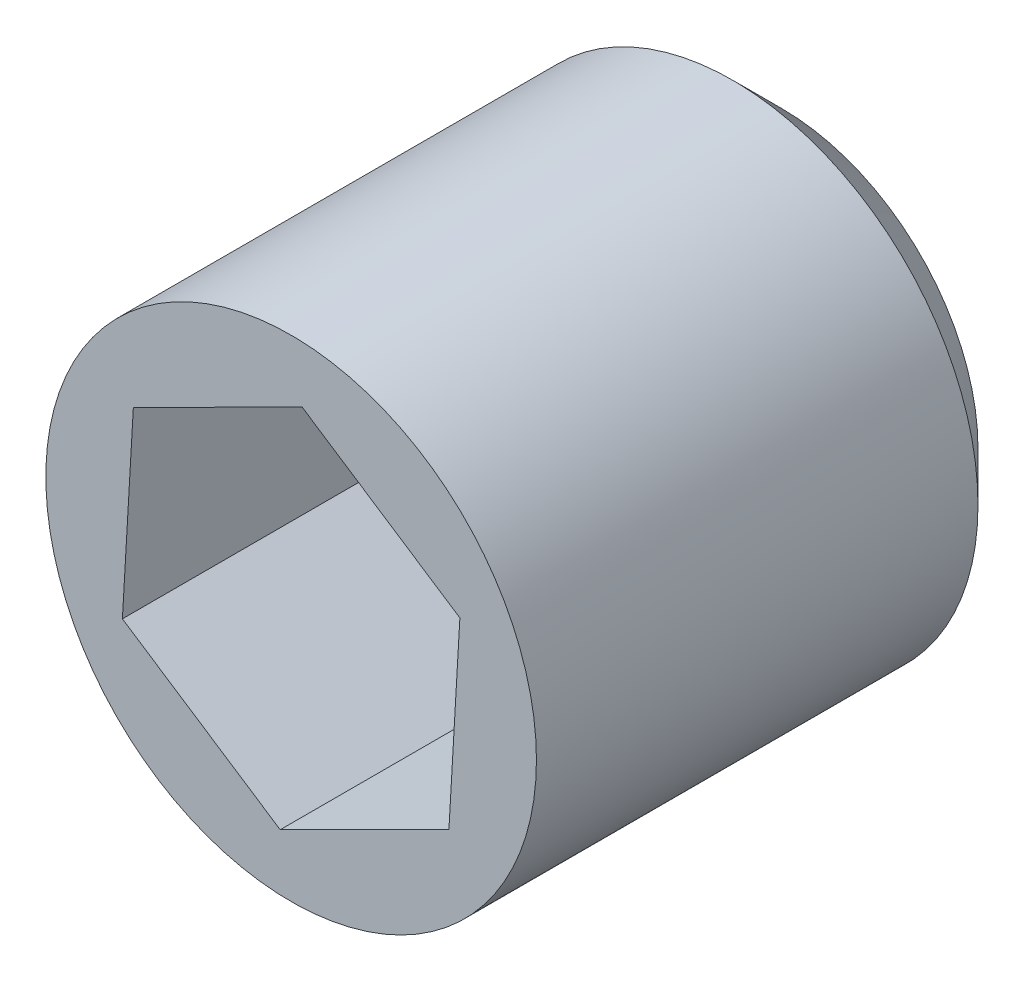
ISO-10303-21;
HEADER;
FILE_DESCRIPTION(('STEP AP214'),'2;1');
FILE_NAME('part.step','',(''),(''),'','','');
FILE_SCHEMA(('AUTOMOTIVE_DESIGN { 1 0 10303 214 1 1 1 1 }'));
ENDSEC;
DATA;
#1=APPLICATION_CONTEXT('core data for automotive mechanical design processes');
#2=APPLICATION_PROTOCOL_DEFINITION('international standard','automotive_design',2000,#1);
#3=PRODUCT_CONTEXT('',#1,'mechanical');
#4=PRODUCT('Part','Part','',(#3));
#5=PRODUCT_RELATED_PRODUCT_CATEGORY('part','',(#4));
#6=PRODUCT_DEFINITION_FORMATION('','',#4);
#7=PRODUCT_DEFINITION_CONTEXT('part definition',#1,'design');
#8=PRODUCT_DEFINITION('design','',#6,#7);
#9=PRODUCT_DEFINITION_SHAPE('','',#8);
#10=(LENGTH_UNIT() NAMED_UNIT(*) SI_UNIT(.MILLI.,.METRE.));
#11=(NAMED_UNIT(*) PLANE_ANGLE_UNIT() SI_UNIT($,.RADIAN.));
#12=(NAMED_UNIT(*) SI_UNIT($,.STERADIAN.) SOLID_ANGLE_UNIT());
#13=UNCERTAINTY_MEASURE_WITH_UNIT(LENGTH_MEASURE(1.E-05),#10,'distance_accuracy_value','');
#14=(GEOMETRIC_REPRESENTATION_CONTEXT(3) GLOBAL_UNCERTAINTY_ASSIGNED_CONTEXT((#13)) GLOBAL_UNIT_ASSIGNED_CONTEXT((#10,
#11,#12)) REPRESENTATION_CONTEXT('',''));
#15=CARTESIAN_POINT('',(0.,0.,0.));
#16=DIRECTION('',(0.,0.,1.));
#17=DIRECTION('',(1.,0.,0.));
#18=AXIS2_PLACEMENT_3D('',#15,#16,#17);
#19=CARTESIAN_POINT('',(0.,0.,3.));
#20=DIRECTION('',(0.,0.,-1.));
#21=DIRECTION('',(-1.,0.,0.));
#22=AXIS2_PLACEMENT_3D('',#19,#20,#21);
#23=CYLINDRICAL_SURFACE('',#22,1.5);
#24=CARTESIAN_POINT('',(0.,0.,0.3));
#25=DIRECTION('',(0.,0.,1.));
#26=DIRECTION('',(1.,0.,0.));
#27=AXIS2_PLACEMENT_3D('',#24,#25,#26);
#28=CIRCLE('',#27,1.5);
#29=CARTESIAN_POINT('',(1.5,0.,0.3));
#30=VERTEX_POINT('',#29);
#31=EDGE_CURVE('E25',#30,#30,#28,.T.);
#32=ORIENTED_EDGE('',*,*,#31,.T.);
#33=EDGE_LOOP('',(#32));
#34=FACE_BOUND('',#33,.T.);
#35=CARTESIAN_POINT('',(0.,0.,3.));
#36=DIRECTION('',(0.,0.,1.));
#37=DIRECTION('',(1.,0.,0.));
#38=AXIS2_PLACEMENT_3D('',#35,#36,#37);
#39=CIRCLE('',#38,1.5);
#40=CARTESIAN_POINT('',(1.5,0.,3.));
#41=VERTEX_POINT('',#40);
#42=EDGE_CURVE('E118',#41,#41,#39,.T.);
#43=ORIENTED_EDGE('',*,*,#42,.F.);
#44=EDGE_LOOP('',(#43));
#45=FACE_BOUND('',#44,.T.);
#46=ADVANCED_FACE('F17',(#34,#45),#23,.T.);
#47=CARTESIAN_POINT('',(0.,0.,3.));
#48=DIRECTION('',(0.,0.,1.));
#49=DIRECTION('',(1.,0.,0.));
#50=AXIS2_PLACEMENT_3D('',#47,#48,#49);
#51=PLANE('',#50);
#52=DIRECTION('',(-0.835585747304561,0.549360044871739,0.));
#53=VECTOR('',#52,1.);
#54=CARTESIAN_POINT('',(1.03178570100904,0.518412577515837,3.));
#55=LINE('',#54,#53);
#56=CARTESIAN_POINT('',(1.03178570100904,0.518412577515837,3.));
#57=VERTEX_POINT('',#56);
#58=CARTESIAN_POINT('',(0.066934388734436,1.15275891709328,3.));
#59=VERTEX_POINT('',#58);
#60=EDGE_CURVE('E32',#57,#59,#55,.T.);
#61=ORIENTED_EDGE('',*,*,#60,.F.);
#62=DIRECTION('',(0.0579668810308043,0.998318506641823,0.));
#63=VECTOR('',#62,1.);
#64=CARTESIAN_POINT('',(0.964851312274606,-0.634346339577446,3.));
#65=LINE('',#64,#63);
#66=CARTESIAN_POINT('',(0.964851312274606,-0.634346339577446,3.));
#67=VERTEX_POINT('',#66);
#68=EDGE_CURVE('E113',#67,#57,#65,.T.);
#69=ORIENTED_EDGE('',*,*,#68,.F.);
#70=DIRECTION('',(0.893552628335365,0.448958461770085,0.));
#71=VECTOR('',#70,1.);
#72=CARTESIAN_POINT('',(-0.0669343887344361,-1.15275891709328,3.));
#73=LINE('',#72,#71);
#74=CARTESIAN_POINT('',(-0.0669343887344361,-1.15275891709328,3.));
#75=VERTEX_POINT('',#74);
#76=EDGE_CURVE('E114',#75,#67,#73,.T.);
#77=ORIENTED_EDGE('',*,*,#76,.F.);
#78=DIRECTION('',(0.835585747304561,-0.549360044871739,0.));
#79=VECTOR('',#78,1.);
#80=CARTESIAN_POINT('',(-1.03178570100904,-0.518412577515837,3.));
#81=LINE('',#80,#79);
#82=CARTESIAN_POINT('',(-1.03178570100904,-0.518412577515837,3.));
#83=VERTEX_POINT('',#82);
#84=EDGE_CURVE('E79',#83,#75,#81,.T.);
#85=ORIENTED_EDGE('',*,*,#84,.F.);
#86=DIRECTION('',(-0.0579668810308043,-0.998318506641824,0.));
#87=VECTOR('',#86,1.);
#88=CARTESIAN_POINT('',(-0.964851312274606,0.634346339577447,3.));
#89=LINE('',#88,#87);
#90=CARTESIAN_POINT('',(-0.964851312274606,0.634346339577447,3.));
#91=VERTEX_POINT('',#90);
#92=EDGE_CURVE('E108',#91,#83,#89,.T.);
#93=ORIENTED_EDGE('',*,*,#92,.F.);
#94=DIRECTION('',(-0.893552628335365,-0.448958461770084,0.));
#95=VECTOR('',#94,1.);
#96=CARTESIAN_POINT('',(0.0669343887344361,1.15275891709328,3.));
#97=LINE('',#96,#95);
#98=EDGE_CURVE('E106',#59,#91,#97,.T.);
#99=ORIENTED_EDGE('',*,*,#98,.F.);
#100=EDGE_LOOP('',(#61,#69,#77,#85,#93,#99));
#101=FACE_BOUND('',#100,.T.);
#102=ORIENTED_EDGE('',*,*,#42,.T.);
#103=EDGE_LOOP('',(#102));
#104=FACE_BOUND('',#103,.T.);
#105=ADVANCED_FACE('F141',(#101,#104),#51,.T.);
#106=CARTESIAN_POINT('',(0.,0.,0.));
#107=DIRECTION('',(0.,0.,1.));
#108=DIRECTION('',(1.,0.,0.));
#109=AXIS2_PLACEMENT_3D('',#106,#107,#108);
#110=PLANE('',#109);
#111=CARTESIAN_POINT('',(0.,0.,0.));
#112=DIRECTION('',(0.,0.,1.));
#113=DIRECTION('',(1.,0.,0.));
#114=AXIS2_PLACEMENT_3D('',#111,#112,#113);
#115=CIRCLE('',#114,1.2);
#116=CARTESIAN_POINT('',(1.2,0.,0.));
#117=VERTEX_POINT('',#116);
#118=EDGE_CURVE('E11',#117,#117,#115,.F.);
#119=ORIENTED_EDGE('',*,*,#118,.T.);
#120=EDGE_LOOP('',(#119));
#121=FACE_BOUND('',#120,.T.);
#122=ADVANCED_FACE('F132',(#121),#110,.F.);
#123=CARTESIAN_POINT('',(0.,0.,0.3));
#124=DIRECTION('',(0.,0.,1.));
#125=DIRECTION('',(1.,0.,0.));
#126=AXIS2_PLACEMENT_3D('',#123,#124,#125);
#127=CONICAL_SURFACE('',#126,1.5,0.78539816339745);
#128=ORIENTED_EDGE('',*,*,#118,.F.);
#129=EDGE_LOOP('',(#128));
#130=FACE_BOUND('',#129,.T.);
#131=ORIENTED_EDGE('',*,*,#31,.F.);
#132=EDGE_LOOP('',(#131));
#133=FACE_BOUND('',#132,.T.);
#134=ADVANCED_FACE('F19',(#130,#133),#127,.T.);
#135=CARTESIAN_POINT('',(1.03178570100904,0.518412577515837,1.));
#136=DIRECTION('',(0.549360044871739,0.835585747304561,0.));
#137=DIRECTION('',(-0.835585747304561,0.549360044871739,0.));
#138=AXIS2_PLACEMENT_3D('',#135,#136,#137);
#139=PLANE('',#138);
#140=ORIENTED_EDGE('',*,*,#60,.T.);
#141=DIRECTION('',(0.,0.,1.));
#142=VECTOR('',#141,1.);
#143=CARTESIAN_POINT('',(0.0669343887344361,1.15275891709328,1.));
#144=LINE('',#143,#142);
#145=CARTESIAN_POINT('',(0.0669343887344361,1.15275891709328,1.));
#146=VERTEX_POINT('',#145);
#147=EDGE_CURVE('E62',#146,#59,#144,.T.);
#148=ORIENTED_EDGE('',*,*,#147,.F.);
#149=DIRECTION('',(-0.835585747304561,0.549360044871739,0.));
#150=VECTOR('',#149,1.);
#151=CARTESIAN_POINT('',(1.03178570100904,0.518412577515837,1.));
#152=LINE('',#151,#150);
#153=CARTESIAN_POINT('',(1.03178570100904,0.518412577515837,1.));
#154=VERTEX_POINT('',#153);
#155=EDGE_CURVE('E117',#154,#146,#152,.T.);
#156=ORIENTED_EDGE('',*,*,#155,.F.);
#157=DIRECTION('',(0.,0.,1.));
#158=VECTOR('',#157,1.);
#159=CARTESIAN_POINT('',(1.03178570100904,0.518412577515837,1.));
#160=LINE('',#159,#158);
#161=EDGE_CURVE('E37',#154,#57,#160,.T.);
#162=ORIENTED_EDGE('',*,*,#161,.T.);
#163=EDGE_LOOP('',(#140,#148,#156,#162));
#164=FACE_BOUND('',#163,.T.);
#165=ADVANCED_FACE('F135',(#164),#139,.F.);
#166=CARTESIAN_POINT('',(0.964851312274606,-0.634346339577446,1.));
#167=DIRECTION('',(0.998318506641824,-0.0579668810308043,0.));
#168=DIRECTION('',(0.0579668810308043,0.998318506641824,0.));
#169=AXIS2_PLACEMENT_3D('',#166,#167,#168);
#170=PLANE('',#169);
#171=ORIENTED_EDGE('',*,*,#68,.T.);
#172=ORIENTED_EDGE('',*,*,#161,.F.);
#173=DIRECTION('',(0.0579668810308043,0.998318506641823,0.));
#174=VECTOR('',#173,1.);
#175=CARTESIAN_POINT('',(0.964851312274606,-0.634346339577446,1.));
#176=LINE('',#175,#174);
#177=CARTESIAN_POINT('',(0.964851312274606,-0.634346339577446,1.));
#178=VERTEX_POINT('',#177);
#179=EDGE_CURVE('E95',#178,#154,#176,.T.);
#180=ORIENTED_EDGE('',*,*,#179,.F.);
#181=DIRECTION('',(0.,0.,1.));
#182=VECTOR('',#181,1.);
#183=CARTESIAN_POINT('',(0.964851312274606,-0.634346339577446,1.));
#184=LINE('',#183,#182);
#185=EDGE_CURVE('E81',#178,#67,#184,.T.);
#186=ORIENTED_EDGE('',*,*,#185,.T.);
#187=EDGE_LOOP('',(#171,#172,#180,#186));
#188=FACE_BOUND('',#187,.T.);
#189=ADVANCED_FACE('F143',(#188),#170,.F.);
#190=CARTESIAN_POINT('',(-0.0669343887344361,-1.15275891709328,1.));
#191=DIRECTION('',(0.448958461770085,-0.893552628335365,0.));
#192=DIRECTION('',(0.893552628335365,0.448958461770085,0.));
#193=AXIS2_PLACEMENT_3D('',#190,#191,#192);
#194=PLANE('',#193);
#195=ORIENTED_EDGE('',*,*,#76,.T.);
#196=ORIENTED_EDGE('',*,*,#185,.F.);
#197=DIRECTION('',(0.893552628335365,0.448958461770085,0.));
#198=VECTOR('',#197,1.);
#199=CARTESIAN_POINT('',(-0.0669343887344361,-1.15275891709328,1.));
#200=LINE('',#199,#198);
#201=CARTESIAN_POINT('',(-0.0669343887344361,-1.15275891709328,1.));
#202=VERTEX_POINT('',#201);
#203=EDGE_CURVE('E86',#202,#178,#200,.T.);
#204=ORIENTED_EDGE('',*,*,#203,.F.);
#205=DIRECTION('',(0.,0.,1.));
#206=VECTOR('',#205,1.);
#207=CARTESIAN_POINT('',(-0.0669343887344361,-1.15275891709328,1.));
#208=LINE('',#207,#206);
#209=EDGE_CURVE('E73',#202,#75,#208,.T.);
#210=ORIENTED_EDGE('',*,*,#209,.T.);
#211=EDGE_LOOP('',(#195,#196,#204,#210));
#212=FACE_BOUND('',#211,.T.);
#213=ADVANCED_FACE('F90',(#212),#194,.F.);
#214=CARTESIAN_POINT('',(-1.03178570100904,-0.518412577515837,1.));
#215=DIRECTION('',(-0.549360044871739,-0.835585747304561,0.));
#216=DIRECTION('',(0.835585747304561,-0.549360044871739,0.));
#217=AXIS2_PLACEMENT_3D('',#214,#215,#216);
#218=PLANE('',#217);
#219=ORIENTED_EDGE('',*,*,#84,.T.);
#220=ORIENTED_EDGE('',*,*,#209,.F.);
#221=DIRECTION('',(0.835585747304561,-0.549360044871739,0.));
#222=VECTOR('',#221,1.);
#223=CARTESIAN_POINT('',(-1.03178570100904,-0.518412577515837,1.));
#224=LINE('',#223,#222);
#225=CARTESIAN_POINT('',(-1.03178570100904,-0.518412577515837,1.));
#226=VERTEX_POINT('',#225);
#227=EDGE_CURVE('E80',#226,#202,#224,.T.);
#228=ORIENTED_EDGE('',*,*,#227,.F.);
#229=DIRECTION('',(0.,0.,1.));
#230=VECTOR('',#229,1.);
#231=CARTESIAN_POINT('',(-1.03178570100904,-0.518412577515837,1.));
#232=LINE('',#231,#230);
#233=EDGE_CURVE('E83',#226,#83,#232,.T.);
#234=ORIENTED_EDGE('',*,*,#233,.T.);
#235=EDGE_LOOP('',(#219,#220,#228,#234));
#236=FACE_BOUND('',#235,.T.);
#237=ADVANCED_FACE('F74',(#236),#218,.F.);
#238=CARTESIAN_POINT('',(-0.964851312274606,0.634346339577447,1.));
#239=DIRECTION('',(-0.998318506641824,0.0579668810308043,0.));
#240=DIRECTION('',(-0.0579668810308043,-0.998318506641824,0.));
#241=AXIS2_PLACEMENT_3D('',#238,#239,#240);
#242=PLANE('',#241);
#243=ORIENTED_EDGE('',*,*,#92,.T.);
#244=ORIENTED_EDGE('',*,*,#233,.F.);
#245=DIRECTION('',(-0.0579668810308043,-0.998318506641824,0.));
#246=VECTOR('',#245,1.);
#247=CARTESIAN_POINT('',(-0.964851312274606,0.634346339577447,1.));
#248=LINE('',#247,#246);
#249=CARTESIAN_POINT('',(-0.964851312274606,0.634346339577447,1.));
#250=VERTEX_POINT('',#249);
#251=EDGE_CURVE('E98',#250,#226,#248,.T.);
#252=ORIENTED_EDGE('',*,*,#251,.F.);
#253=DIRECTION('',(0.,0.,1.));
#254=VECTOR('',#253,1.);
#255=CARTESIAN_POINT('',(-0.964851312274606,0.634346339577447,1.));
#256=LINE('',#255,#254);
#257=EDGE_CURVE('E121',#250,#91,#256,.T.);
#258=ORIENTED_EDGE('',*,*,#257,.T.);
#259=EDGE_LOOP('',(#243,#244,#252,#258));
#260=FACE_BOUND('',#259,.T.);
#261=ADVANCED_FACE('F158',(#260),#242,.F.);
#262=CARTESIAN_POINT('',(0.0669343887344361,1.15275891709328,1.));
#263=DIRECTION('',(-0.448958461770084,0.893552628335365,0.));
#264=DIRECTION('',(-0.893552628335365,-0.448958461770084,0.));
#265=AXIS2_PLACEMENT_3D('',#262,#263,#264);
#266=PLANE('',#265);
#267=ORIENTED_EDGE('',*,*,#98,.T.);
#268=ORIENTED_EDGE('',*,*,#257,.F.);
#269=DIRECTION('',(-0.893552628335365,-0.448958461770084,0.));
#270=VECTOR('',#269,1.);
#271=CARTESIAN_POINT('',(0.0669343887344361,1.15275891709328,1.));
#272=LINE('',#271,#270);
#273=EDGE_CURVE('E99',#146,#250,#272,.T.);
#274=ORIENTED_EDGE('',*,*,#273,.F.);
#275=ORIENTED_EDGE('',*,*,#147,.T.);
#276=EDGE_LOOP('',(#267,#268,#274,#275));
#277=FACE_BOUND('',#276,.T.);
#278=ADVANCED_FACE('F154',(#277),#266,.F.);
#279=CARTESIAN_POINT('',(0.,0.,1.));
#280=DIRECTION('',(0.,0.,1.));
#281=DIRECTION('',(1.,0.,0.));
#282=AXIS2_PLACEMENT_3D('',#279,#280,#281);
#283=PLANE('',#282);
#284=ORIENTED_EDGE('',*,*,#155,.T.);
#285=ORIENTED_EDGE('',*,*,#273,.T.);
#286=ORIENTED_EDGE('',*,*,#251,.T.);
#287=ORIENTED_EDGE('',*,*,#227,.T.);
#288=ORIENTED_EDGE('',*,*,#203,.T.);
#289=ORIENTED_EDGE('',*,*,#179,.T.);
#290=EDGE_LOOP('',(#284,#285,#286,#287,#288,#289));
#291=FACE_BOUND('',#290,.T.);
#292=ADVANCED_FACE('F92',(#291),#283,.T.);
#293=CLOSED_SHELL('',(#46,#105,#122,#134,#165,#189,#213,#237,#261,#278,#292));
#294=MANIFOLD_SOLID_BREP('B1',#293);
#295=ADVANCED_BREP_SHAPE_REPRESENTATION('',(#18,#294),#14);
#296=SHAPE_DEFINITION_REPRESENTATION(#9,#295);
ENDSEC;
END-ISO-10303-21;
